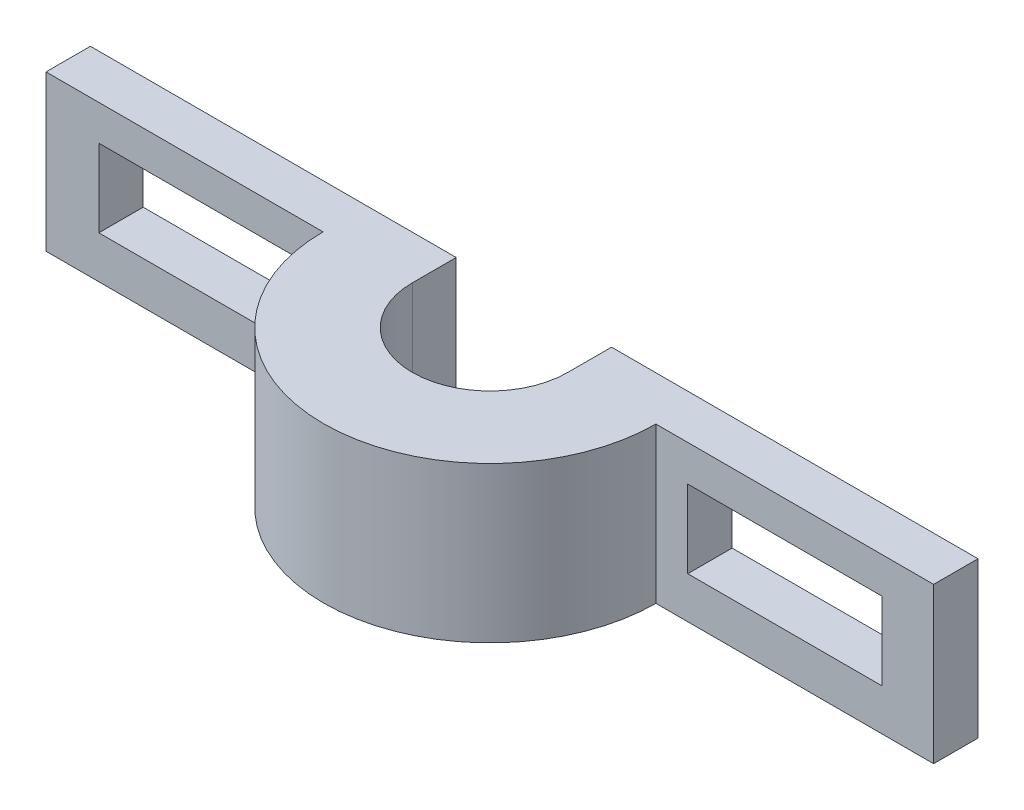
ISO-10303-21;
HEADER;
FILE_DESCRIPTION(('STEP AP214'),'2;1');
FILE_NAME('part.step','',(''),(''),'','','');
FILE_SCHEMA(('AUTOMOTIVE_DESIGN { 1 0 10303 214 1 1 1 1 }'));
ENDSEC;
DATA;
#1=APPLICATION_CONTEXT('core data for automotive mechanical design processes');
#2=APPLICATION_PROTOCOL_DEFINITION('international standard','automotive_design',2000,#1);
#3=PRODUCT_CONTEXT('',#1,'mechanical');
#4=PRODUCT('Part','Part','',(#3));
#5=PRODUCT_RELATED_PRODUCT_CATEGORY('part','',(#4));
#6=PRODUCT_DEFINITION_FORMATION('','',#4);
#7=PRODUCT_DEFINITION_CONTEXT('part definition',#1,'design');
#8=PRODUCT_DEFINITION('design','',#6,#7);
#9=PRODUCT_DEFINITION_SHAPE('','',#8);
#10=(LENGTH_UNIT() NAMED_UNIT(*) SI_UNIT(.MILLI.,.METRE.));
#11=(NAMED_UNIT(*) PLANE_ANGLE_UNIT() SI_UNIT($,.RADIAN.));
#12=(NAMED_UNIT(*) SI_UNIT($,.STERADIAN.) SOLID_ANGLE_UNIT());
#13=UNCERTAINTY_MEASURE_WITH_UNIT(LENGTH_MEASURE(1.E-05),#10,'distance_accuracy_value','');
#14=(GEOMETRIC_REPRESENTATION_CONTEXT(3) GLOBAL_UNCERTAINTY_ASSIGNED_CONTEXT((#13)) GLOBAL_UNIT_ASSIGNED_CONTEXT((#10,
#11,#12)) REPRESENTATION_CONTEXT('',''));
#15=CARTESIAN_POINT('',(0.,0.,0.));
#16=DIRECTION('',(0.,0.,1.));
#17=DIRECTION('',(1.,0.,0.));
#18=AXIS2_PLACEMENT_3D('',#15,#16,#17);
#19=CARTESIAN_POINT('',(0.,7.,0.));
#20=DIRECTION('',(0.,-1.,0.));
#21=DIRECTION('',(0.,0.,-1.));
#22=AXIS2_PLACEMENT_3D('',#19,#20,#21);
#23=CYLINDRICAL_SURFACE('',#22,3.5);
#24=CARTESIAN_POINT('',(0.,0.,0.));
#25=DIRECTION('',(0.,-1.,0.));
#26=DIRECTION('',(0.,0.,-1.));
#27=AXIS2_PLACEMENT_3D('',#24,#25,#26);
#28=CIRCLE('',#27,3.5);
#29=CARTESIAN_POINT('',(3.5,0.,0.));
#30=VERTEX_POINT('',#29);
#31=CARTESIAN_POINT('',(-3.5,0.,0.));
#32=VERTEX_POINT('',#31);
#33=EDGE_CURVE('E386',#30,#32,#28,.T.);
#34=ORIENTED_EDGE('',*,*,#33,.T.);
#35=DIRECTION('',(0.,-1.,0.));
#36=VECTOR('',#35,1.);
#37=CARTESIAN_POINT('',(-3.5,7.,0.));
#38=LINE('',#37,#36);
#39=CARTESIAN_POINT('',(-3.5,7.,0.));
#40=VERTEX_POINT('',#39);
#41=EDGE_CURVE('E390',#40,#32,#38,.T.);
#42=ORIENTED_EDGE('',*,*,#41,.F.);
#43=CARTESIAN_POINT('',(0.,7.,0.));
#44=DIRECTION('',(0.,-1.,0.));
#45=DIRECTION('',(0.,0.,-1.));
#46=AXIS2_PLACEMENT_3D('',#43,#44,#45);
#47=CIRCLE('',#46,3.5);
#48=CARTESIAN_POINT('',(3.5,7.,0.));
#49=VERTEX_POINT('',#48);
#50=EDGE_CURVE('E187',#49,#40,#47,.T.);
#51=ORIENTED_EDGE('',*,*,#50,.F.);
#52=DIRECTION('',(0.,-1.,0.));
#53=VECTOR('',#52,1.);
#54=CARTESIAN_POINT('',(3.5,7.,0.));
#55=LINE('',#54,#53);
#56=EDGE_CURVE('E391',#49,#30,#55,.T.);
#57=ORIENTED_EDGE('',*,*,#56,.T.);
#58=EDGE_LOOP('',(#34,#42,#51,#57));
#59=FACE_BOUND('',#58,.T.);
#60=ADVANCED_FACE('F45',(#59),#23,.F.);
#61=CARTESIAN_POINT('',(-19.9853337708473,7.,-1.9751587177036));
#62=DIRECTION('',(0.,0.,-1.));
#63=DIRECTION('',(-1.,0.,0.));
#64=AXIS2_PLACEMENT_3D('',#61,#62,#63);
#65=PLANE('',#64);
#66=DIRECTION('',(0.,-1.,0.));
#67=VECTOR('',#66,1.);
#68=CARTESIAN_POINT('',(3.5,7.,-1.9751587177036));
#69=LINE('',#68,#67);
#70=CARTESIAN_POINT('',(3.5,7.,-1.9751587177036));
#71=VERTEX_POINT('',#70);
#72=CARTESIAN_POINT('',(3.5,0.,-1.9751587177036));
#73=VERTEX_POINT('',#72);
#74=EDGE_CURVE('E176',#71,#73,#69,.T.);
#75=ORIENTED_EDGE('',*,*,#74,.F.);
#76=DIRECTION('',(1.,0.,0.));
#77=VECTOR('',#76,1.);
#78=CARTESIAN_POINT('',(-19.9853337708473,7.,-1.9751587177036));
#79=LINE('',#78,#77);
#80=CARTESIAN_POINT('',(20.0146662291527,7.,-1.9751587177036));
#81=VERTEX_POINT('',#80);
#82=EDGE_CURVE('E197',#71,#81,#79,.T.);
#83=ORIENTED_EDGE('',*,*,#82,.T.);
#84=DIRECTION('',(0.,-1.,0.));
#85=VECTOR('',#84,1.);
#86=CARTESIAN_POINT('',(20.0146662291527,7.,-1.9751587177036));
#87=LINE('',#86,#85);
#88=CARTESIAN_POINT('',(20.0146662291527,0.,-1.9751587177036));
#89=VERTEX_POINT('',#88);
#90=EDGE_CURVE('E216',#81,#89,#87,.T.);
#91=ORIENTED_EDGE('',*,*,#90,.T.);
#92=DIRECTION('',(1.,0.,0.));
#93=VECTOR('',#92,1.);
#94=CARTESIAN_POINT('',(-19.9853337708473,0.,-1.9751587177036));
#95=LINE('',#94,#93);
#96=EDGE_CURVE('E221',#73,#89,#95,.T.);
#97=ORIENTED_EDGE('',*,*,#96,.F.);
#98=EDGE_LOOP('',(#75,#83,#91,#97));
#99=FACE_BOUND('',#98,.T.);
#100=DIRECTION('',(0.,-1.,0.));
#101=VECTOR('',#100,1.);
#102=CARTESIAN_POINT('',(17.6901271123471,5.37574665961989,-1.9751587177036));
#103=LINE('',#102,#101);
#104=CARTESIAN_POINT('',(17.6901271123471,5.37574665961989,-1.9751587177036));
#105=VERTEX_POINT('',#104);
#106=CARTESIAN_POINT('',(17.6901271123471,1.87574665961989,-1.9751587177036));
#107=VERTEX_POINT('',#106);
#108=EDGE_CURVE('E299',#105,#107,#103,.T.);
#109=ORIENTED_EDGE('',*,*,#108,.F.);
#110=DIRECTION('',(1.,0.,0.));
#111=VECTOR('',#110,1.);
#112=CARTESIAN_POINT('',(-19.9853337708473,5.37574665961989,-1.9751587177036));
#113=LINE('',#112,#111);
#114=CARTESIAN_POINT('',(8.93428933754407,5.37574665961989,-1.9751587177036));
#115=VERTEX_POINT('',#114);
#116=EDGE_CURVE('E345',#115,#105,#113,.T.);
#117=ORIENTED_EDGE('',*,*,#116,.F.);
#118=DIRECTION('',(0.,1.,0.));
#119=VECTOR('',#118,1.);
#120=CARTESIAN_POINT('',(8.93428933754407,7.,-1.9751587177036));
#121=LINE('',#120,#119);
#122=CARTESIAN_POINT('',(8.93428933754407,1.87574665961989,-1.9751587177036));
#123=VERTEX_POINT('',#122);
#124=EDGE_CURVE('E206',#123,#115,#121,.T.);
#125=ORIENTED_EDGE('',*,*,#124,.F.);
#126=DIRECTION('',(-1.,0.,0.));
#127=VECTOR('',#126,1.);
#128=CARTESIAN_POINT('',(-19.9853337708473,1.87574665961989,-1.9751587177036));
#129=LINE('',#128,#127);
#130=EDGE_CURVE('E328',#107,#123,#129,.T.);
#131=ORIENTED_EDGE('',*,*,#130,.F.);
#132=EDGE_LOOP('',(#109,#117,#125,#131));
#133=FACE_BOUND('',#132,.T.);
#134=ADVANCED_FACE('F365',(#99,#133),#65,.T.);
#135=CARTESIAN_POINT('',(0.,7.,0.));
#136=DIRECTION('',(0.,-1.,0.));
#137=DIRECTION('',(0.,0.,-1.));
#138=AXIS2_PLACEMENT_3D('',#135,#136,#137);
#139=CYLINDRICAL_SURFACE('',#138,7.5);
#140=DIRECTION('',(0.,-1.,0.));
#141=VECTOR('',#140,1.);
#142=CARTESIAN_POINT('',(7.49995886060009,7.,0.0248412822963966));
#143=LINE('',#142,#141);
#144=CARTESIAN_POINT('',(7.49995886060009,7.,0.0248412822963966));
#145=VERTEX_POINT('',#144);
#146=CARTESIAN_POINT('',(7.49995886060009,0.,0.0248412822963966));
#147=VERTEX_POINT('',#146);
#148=EDGE_CURVE('E249',#145,#147,#143,.T.);
#149=ORIENTED_EDGE('',*,*,#148,.F.);
#150=CARTESIAN_POINT('',(0.,7.,0.));
#151=DIRECTION('',(0.,1.,0.));
#152=DIRECTION('',(0.,0.,1.));
#153=AXIS2_PLACEMENT_3D('',#150,#151,#152);
#154=CIRCLE('',#153,7.5);
#155=CARTESIAN_POINT('',(-7.49995886060009,7.,0.0248412822963966));
#156=VERTEX_POINT('',#155);
#157=EDGE_CURVE('E254',#156,#145,#154,.T.);
#158=ORIENTED_EDGE('',*,*,#157,.F.);
#159=DIRECTION('',(0.,-1.,0.));
#160=VECTOR('',#159,1.);
#161=CARTESIAN_POINT('',(-7.49995886060009,7.,0.0248412822963966));
#162=LINE('',#161,#160);
#163=CARTESIAN_POINT('',(-7.4999588606001,0.,0.0248412822963966));
#164=VERTEX_POINT('',#163);
#165=EDGE_CURVE('E235',#164,#156,#162,.F.);
#166=ORIENTED_EDGE('',*,*,#165,.F.);
#167=CARTESIAN_POINT('',(0.,0.,0.));
#168=DIRECTION('',(0.,1.,0.));
#169=DIRECTION('',(0.,0.,1.));
#170=AXIS2_PLACEMENT_3D('',#167,#168,#169);
#171=CIRCLE('',#170,7.5);
#172=EDGE_CURVE('E253',#164,#147,#171,.T.);
#173=ORIENTED_EDGE('',*,*,#172,.T.);
#174=EDGE_LOOP('',(#149,#158,#166,#173));
#175=FACE_BOUND('',#174,.T.);
#176=ADVANCED_FACE('F47',(#175),#139,.T.);
#177=CARTESIAN_POINT('',(0.,7.,0.));
#178=DIRECTION('',(0.,1.,0.));
#179=DIRECTION('',(0.,0.,1.));
#180=AXIS2_PLACEMENT_3D('',#177,#178,#179);
#181=PLANE('',#180);
#182=DIRECTION('',(0.,0.,-1.));
#183=VECTOR('',#182,1.);
#184=CARTESIAN_POINT('',(-3.5,7.,0.));
#185=LINE('',#184,#183);
#186=CARTESIAN_POINT('',(-3.5,7.,-1.9751587177036));
#187=VERTEX_POINT('',#186);
#188=EDGE_CURVE('E61',#40,#187,#185,.T.);
#189=ORIENTED_EDGE('',*,*,#188,.T.);
#190=CARTESIAN_POINT('',(-19.9853337708473,7.,-1.9751587177036));
#191=VERTEX_POINT('',#190);
#192=EDGE_CURVE('E183',#191,#187,#79,.T.);
#193=ORIENTED_EDGE('',*,*,#192,.F.);
#194=DIRECTION('',(0.,0.,-1.));
#195=VECTOR('',#194,1.);
#196=CARTESIAN_POINT('',(-19.9853337708473,7.,0.0248412822963966));
#197=LINE('',#196,#195);
#198=CARTESIAN_POINT('',(-19.9853337708473,7.,0.0248412822963966));
#199=VERTEX_POINT('',#198);
#200=EDGE_CURVE('E213',#199,#191,#197,.T.);
#201=ORIENTED_EDGE('',*,*,#200,.F.);
#202=DIRECTION('',(1.,0.,0.));
#203=VECTOR('',#202,1.);
#204=CARTESIAN_POINT('',(-19.9853337708473,7.,0.0248412822963966));
#205=LINE('',#204,#203);
#206=EDGE_CURVE('E209',#199,#156,#205,.T.);
#207=ORIENTED_EDGE('',*,*,#206,.T.);
#208=ORIENTED_EDGE('',*,*,#157,.T.);
#209=CARTESIAN_POINT('',(20.0146662291527,7.,0.0248412822963966));
#210=VERTEX_POINT('',#209);
#211=EDGE_CURVE('E202',#145,#210,#205,.T.);
#212=ORIENTED_EDGE('',*,*,#211,.T.);
#213=DIRECTION('',(0.,0.,-1.));
#214=VECTOR('',#213,1.);
#215=CARTESIAN_POINT('',(20.0146662291527,7.,0.0248412822963966));
#216=LINE('',#215,#214);
#217=EDGE_CURVE('E196',#210,#81,#216,.T.);
#218=ORIENTED_EDGE('',*,*,#217,.T.);
#219=ORIENTED_EDGE('',*,*,#82,.F.);
#220=DIRECTION('',(0.,0.,1.));
#221=VECTOR('',#220,1.);
#222=CARTESIAN_POINT('',(3.5,7.,0.));
#223=LINE('',#222,#221);
#224=EDGE_CURVE('E177',#71,#49,#223,.T.);
#225=ORIENTED_EDGE('',*,*,#224,.T.);
#226=ORIENTED_EDGE('',*,*,#50,.T.);
#227=EDGE_LOOP('',(#189,#193,#201,#207,#208,#212,#218,#219,#225,#226));
#228=FACE_BOUND('',#227,.T.);
#229=ADVANCED_FACE('F181',(#228),#181,.T.);
#230=CARTESIAN_POINT('',(0.,0.,0.));
#231=DIRECTION('',(0.,1.,0.));
#232=DIRECTION('',(0.,0.,1.));
#233=AXIS2_PLACEMENT_3D('',#230,#231,#232);
#234=PLANE('',#233);
#235=CARTESIAN_POINT('',(-19.9853337708473,0.,-1.9751587177036));
#236=VERTEX_POINT('',#235);
#237=CARTESIAN_POINT('',(-3.5,0.,-1.9751587177036));
#238=VERTEX_POINT('',#237);
#239=EDGE_CURVE('E217',#236,#238,#95,.T.);
#240=ORIENTED_EDGE('',*,*,#239,.T.);
#241=DIRECTION('',(0.,0.,-1.));
#242=VECTOR('',#241,1.);
#243=CARTESIAN_POINT('',(-3.5,0.,0.));
#244=LINE('',#243,#242);
#245=EDGE_CURVE('E171',#32,#238,#244,.T.);
#246=ORIENTED_EDGE('',*,*,#245,.F.);
#247=ORIENTED_EDGE('',*,*,#33,.F.);
#248=DIRECTION('',(0.,0.,1.));
#249=VECTOR('',#248,1.);
#250=CARTESIAN_POINT('',(3.5,0.,0.));
#251=LINE('',#250,#249);
#252=EDGE_CURVE('E69',#73,#30,#251,.T.);
#253=ORIENTED_EDGE('',*,*,#252,.F.);
#254=ORIENTED_EDGE('',*,*,#96,.T.);
#255=DIRECTION('',(0.,0.,-1.));
#256=VECTOR('',#255,1.);
#257=CARTESIAN_POINT('',(20.0146662291527,0.,0.0248412822963966));
#258=LINE('',#257,#256);
#259=CARTESIAN_POINT('',(20.0146662291527,0.,0.0248412822963966));
#260=VERTEX_POINT('',#259);
#261=EDGE_CURVE('E220',#260,#89,#258,.T.);
#262=ORIENTED_EDGE('',*,*,#261,.F.);
#263=DIRECTION('',(1.,0.,0.));
#264=VECTOR('',#263,1.);
#265=CARTESIAN_POINT('',(-19.9853337708473,0.,0.0248412822963966));
#266=LINE('',#265,#264);
#267=EDGE_CURVE('E225',#147,#260,#266,.T.);
#268=ORIENTED_EDGE('',*,*,#267,.F.);
#269=ORIENTED_EDGE('',*,*,#172,.F.);
#270=CARTESIAN_POINT('',(-19.9853337708473,0.,0.0248412822963966));
#271=VERTEX_POINT('',#270);
#272=EDGE_CURVE('E226',#271,#164,#266,.T.);
#273=ORIENTED_EDGE('',*,*,#272,.F.);
#274=DIRECTION('',(0.,0.,-1.));
#275=VECTOR('',#274,1.);
#276=CARTESIAN_POINT('',(-19.9853337708473,0.,0.0248412822963966));
#277=LINE('',#276,#275);
#278=EDGE_CURVE('E204',#271,#236,#277,.T.);
#279=ORIENTED_EDGE('',*,*,#278,.T.);
#280=EDGE_LOOP('',(#240,#246,#247,#253,#254,#262,#268,#269,#273,#279));
#281=FACE_BOUND('',#280,.T.);
#282=ADVANCED_FACE('F359',(#281),#234,.F.);
#283=CARTESIAN_POINT('',(-19.9853337708473,7.,0.0248412822963966));
#284=DIRECTION('',(-1.,0.,0.));
#285=DIRECTION('',(0.,0.,1.));
#286=AXIS2_PLACEMENT_3D('',#283,#284,#285);
#287=PLANE('',#286);
#288=ORIENTED_EDGE('',*,*,#278,.F.);
#289=DIRECTION('',(0.,-1.,0.));
#290=VECTOR('',#289,1.);
#291=CARTESIAN_POINT('',(-19.9853337708473,7.,0.0248412822963966));
#292=LINE('',#291,#290);
#293=EDGE_CURVE('E236',#199,#271,#292,.T.);
#294=ORIENTED_EDGE('',*,*,#293,.F.);
#295=ORIENTED_EDGE('',*,*,#200,.T.);
#296=DIRECTION('',(0.,-1.,0.));
#297=VECTOR('',#296,1.);
#298=CARTESIAN_POINT('',(-19.9853337708473,7.,-1.9751587177036));
#299=LINE('',#298,#297);
#300=EDGE_CURVE('E193',#191,#236,#299,.T.);
#301=ORIENTED_EDGE('',*,*,#300,.T.);
#302=EDGE_LOOP('',(#288,#294,#295,#301));
#303=FACE_BOUND('',#302,.T.);
#304=ADVANCED_FACE('F384',(#303),#287,.T.);
#305=CARTESIAN_POINT('',(-19.9853337708473,7.,0.0248412822963966));
#306=DIRECTION('',(0.,0.,-1.));
#307=DIRECTION('',(-1.,0.,0.));
#308=AXIS2_PLACEMENT_3D('',#305,#306,#307);
#309=PLANE('',#308);
#310=DIRECTION('',(1.,0.,0.));
#311=VECTOR('',#310,1.);
#312=CARTESIAN_POINT('',(-18.6050470096143,1.90967128129818,0.0248412822963966));
#313=LINE('',#312,#311);
#314=CARTESIAN_POINT('',(-17.6050470096143,1.90967128129818,0.0248412822963966));
#315=VERTEX_POINT('',#314);
#316=CARTESIAN_POINT('',(-8.84920923481122,1.90967128129818,0.0248412822963966));
#317=VERTEX_POINT('',#316);
#318=EDGE_CURVE('E317',#315,#317,#313,.T.);
#319=ORIENTED_EDGE('',*,*,#318,.F.);
#320=DIRECTION('',(0.,1.,0.));
#321=VECTOR('',#320,1.);
#322=CARTESIAN_POINT('',(-17.6050470096143,5.40967128129818,0.0248412822963966));
#323=LINE('',#322,#321);
#324=CARTESIAN_POINT('',(-17.6050470096143,5.40967128129818,0.0248412822963966));
#325=VERTEX_POINT('',#324);
#326=EDGE_CURVE('E288',#315,#325,#323,.T.);
#327=ORIENTED_EDGE('',*,*,#326,.T.);
#328=DIRECTION('',(-1.,0.,0.));
#329=VECTOR('',#328,1.);
#330=CARTESIAN_POINT('',(-18.6050470096143,5.40967128129818,0.0248412822963966));
#331=LINE('',#330,#329);
#332=CARTESIAN_POINT('',(-8.84920923481122,5.40967128129818,0.0248412822963966));
#333=VERTEX_POINT('',#332);
#334=EDGE_CURVE('E334',#333,#325,#331,.T.);
#335=ORIENTED_EDGE('',*,*,#334,.F.);
#336=DIRECTION('',(0.,1.,0.));
#337=VECTOR('',#336,1.);
#338=CARTESIAN_POINT('',(-8.84920923481122,5.40967128129818,0.0248412822963966));
#339=LINE('',#338,#337);
#340=EDGE_CURVE('E339',#317,#333,#339,.T.);
#341=ORIENTED_EDGE('',*,*,#340,.F.);
#342=EDGE_LOOP('',(#319,#327,#335,#341));
#343=FACE_BOUND('',#342,.T.);
#344=ORIENTED_EDGE('',*,*,#272,.T.);
#345=ORIENTED_EDGE('',*,*,#165,.T.);
#346=ORIENTED_EDGE('',*,*,#206,.F.);
#347=ORIENTED_EDGE('',*,*,#293,.T.);
#348=EDGE_LOOP('',(#344,#345,#346,#347));
#349=FACE_BOUND('',#348,.T.);
#350=ADVANCED_FACE('F382',(#343,#349),#309,.F.);
#351=DIRECTION('',(0.,-1.,0.));
#352=VECTOR('',#351,1.);
#353=CARTESIAN_POINT('',(-3.5,7.,-1.9751587177036));
#354=LINE('',#353,#352);
#355=EDGE_CURVE('E168',#187,#238,#354,.T.);
#356=ORIENTED_EDGE('',*,*,#355,.T.);
#357=ORIENTED_EDGE('',*,*,#239,.F.);
#358=ORIENTED_EDGE('',*,*,#300,.F.);
#359=ORIENTED_EDGE('',*,*,#192,.T.);
#360=EDGE_LOOP('',(#356,#357,#358,#359));
#361=FACE_BOUND('',#360,.T.);
#362=DIRECTION('',(1.,0.,0.));
#363=VECTOR('',#362,1.);
#364=CARTESIAN_POINT('',(-19.9853337708473,5.40967128129818,-1.9751587177036));
#365=LINE('',#364,#363);
#366=CARTESIAN_POINT('',(-17.6050470096143,5.40967128129818,-1.9751587177036));
#367=VERTEX_POINT('',#366);
#368=CARTESIAN_POINT('',(-8.84920923481122,5.40967128129818,-1.9751587177036));
#369=VERTEX_POINT('',#368);
#370=EDGE_CURVE('E11',#367,#369,#365,.T.);
#371=ORIENTED_EDGE('',*,*,#370,.F.);
#372=DIRECTION('',(0.,1.,0.));
#373=VECTOR('',#372,1.);
#374=CARTESIAN_POINT('',(-17.6050470096143,5.40967128129818,-1.9751587177036));
#375=LINE('',#374,#373);
#376=CARTESIAN_POINT('',(-17.6050470096143,1.90967128129818,-1.9751587177036));
#377=VERTEX_POINT('',#376);
#378=EDGE_CURVE('E277',#377,#367,#375,.T.);
#379=ORIENTED_EDGE('',*,*,#378,.F.);
#380=DIRECTION('',(-1.,0.,0.));
#381=VECTOR('',#380,1.);
#382=CARTESIAN_POINT('',(-19.9853337708473,1.90967128129818,-1.9751587177036));
#383=LINE('',#382,#381);
#384=CARTESIAN_POINT('',(-8.84920923481122,1.90967128129818,-1.9751587177036));
#385=VERTEX_POINT('',#384);
#386=EDGE_CURVE('E258',#385,#377,#383,.T.);
#387=ORIENTED_EDGE('',*,*,#386,.F.);
#388=DIRECTION('',(0.,-1.,0.));
#389=VECTOR('',#388,1.);
#390=CARTESIAN_POINT('',(-8.84920923481122,7.,-1.9751587177036));
#391=LINE('',#390,#389);
#392=EDGE_CURVE('E54',#369,#385,#391,.T.);
#393=ORIENTED_EDGE('',*,*,#392,.F.);
#394=EDGE_LOOP('',(#371,#379,#387,#393));
#395=FACE_BOUND('',#394,.T.);
#396=ADVANCED_FACE('F190',(#361,#395),#65,.T.);
#397=DIRECTION('',(-1.,0.,0.));
#398=VECTOR('',#397,1.);
#399=CARTESIAN_POINT('',(8.93428933754407,5.37574665961989,0.0248412822963966));
#400=LINE('',#399,#398);
#401=CARTESIAN_POINT('',(17.6901271123471,5.37574665961989,0.0248412822963966));
#402=VERTEX_POINT('',#401);
#403=CARTESIAN_POINT('',(8.93428933754407,5.37574665961989,0.0248412822963966));
#404=VERTEX_POINT('',#403);
#405=EDGE_CURVE('E320',#402,#404,#400,.T.);
#406=ORIENTED_EDGE('',*,*,#405,.F.);
#407=DIRECTION('',(0.,-1.,0.));
#408=VECTOR('',#407,1.);
#409=CARTESIAN_POINT('',(17.6901271123471,5.37574665961989,0.0248412822963966));
#410=LINE('',#409,#408);
#411=CARTESIAN_POINT('',(17.6901271123471,1.87574665961989,0.0248412822963966));
#412=VERTEX_POINT('',#411);
#413=EDGE_CURVE('E294',#402,#412,#410,.T.);
#414=ORIENTED_EDGE('',*,*,#413,.T.);
#415=DIRECTION('',(1.,0.,0.));
#416=VECTOR('',#415,1.);
#417=CARTESIAN_POINT('',(8.93428933754407,1.87574665961989,0.0248412822963966));
#418=LINE('',#417,#416);
#419=CARTESIAN_POINT('',(8.93428933754407,1.87574665961989,0.0248412822963966));
#420=VERTEX_POINT('',#419);
#421=EDGE_CURVE('E316',#420,#412,#418,.T.);
#422=ORIENTED_EDGE('',*,*,#421,.F.);
#423=DIRECTION('',(0.,-1.,0.));
#424=VECTOR('',#423,1.);
#425=CARTESIAN_POINT('',(8.93428933754407,5.37574665961989,0.0248412822963966));
#426=LINE('',#425,#424);
#427=EDGE_CURVE('E313',#404,#420,#426,.T.);
#428=ORIENTED_EDGE('',*,*,#427,.F.);
#429=EDGE_LOOP('',(#406,#414,#422,#428));
#430=FACE_BOUND('',#429,.T.);
#431=ORIENTED_EDGE('',*,*,#211,.F.);
#432=ORIENTED_EDGE('',*,*,#148,.T.);
#433=ORIENTED_EDGE('',*,*,#267,.T.);
#434=DIRECTION('',(0.,-1.,0.));
#435=VECTOR('',#434,1.);
#436=CARTESIAN_POINT('',(20.0146662291527,7.,0.0248412822963966));
#437=LINE('',#436,#435);
#438=EDGE_CURVE('E239',#210,#260,#437,.T.);
#439=ORIENTED_EDGE('',*,*,#438,.F.);
#440=EDGE_LOOP('',(#431,#432,#433,#439));
#441=FACE_BOUND('',#440,.T.);
#442=ADVANCED_FACE('F374',(#430,#441),#309,.F.);
#443=CARTESIAN_POINT('',(20.0146662291527,7.,0.0248412822963966));
#444=DIRECTION('',(-1.,0.,0.));
#445=DIRECTION('',(0.,0.,1.));
#446=AXIS2_PLACEMENT_3D('',#443,#444,#445);
#447=PLANE('',#446);
#448=ORIENTED_EDGE('',*,*,#261,.T.);
#449=ORIENTED_EDGE('',*,*,#90,.F.);
#450=ORIENTED_EDGE('',*,*,#217,.F.);
#451=ORIENTED_EDGE('',*,*,#438,.T.);
#452=EDGE_LOOP('',(#448,#449,#450,#451));
#453=FACE_BOUND('',#452,.T.);
#454=ADVANCED_FACE('F370',(#453),#447,.F.);
#455=CARTESIAN_POINT('',(8.93428933754407,5.37574665961989,-6.9751587177036));
#456=DIRECTION('',(-1.,0.,0.));
#457=DIRECTION('',(0.,0.,1.));
#458=AXIS2_PLACEMENT_3D('',#455,#456,#457);
#459=PLANE('',#458);
#460=ORIENTED_EDGE('',*,*,#124,.T.);
#461=DIRECTION('',(0.,0.,1.));
#462=VECTOR('',#461,1.);
#463=CARTESIAN_POINT('',(8.93428933754407,5.37574665961989,-6.9751587177036));
#464=LINE('',#463,#462);
#465=EDGE_CURVE('E324',#115,#404,#464,.T.);
#466=ORIENTED_EDGE('',*,*,#465,.T.);
#467=ORIENTED_EDGE('',*,*,#427,.T.);
#468=DIRECTION('',(0.,0.,1.));
#469=VECTOR('',#468,1.);
#470=CARTESIAN_POINT('',(8.93428933754407,1.87574665961989,-6.9751587177036));
#471=LINE('',#470,#469);
#472=EDGE_CURVE('E323',#123,#420,#471,.T.);
#473=ORIENTED_EDGE('',*,*,#472,.F.);
#474=EDGE_LOOP('',(#460,#466,#467,#473));
#475=FACE_BOUND('',#474,.T.);
#476=ADVANCED_FACE('F434',(#475),#459,.F.);
#477=CARTESIAN_POINT('',(8.93428933754407,5.37574665961989,-6.9751587177036));
#478=DIRECTION('',(0.,1.,0.));
#479=DIRECTION('',(0.,0.,1.));
#480=AXIS2_PLACEMENT_3D('',#477,#478,#479);
#481=PLANE('',#480);
#482=ORIENTED_EDGE('',*,*,#116,.T.);
#483=DIRECTION('',(0.,0.,1.));
#484=VECTOR('',#483,1.);
#485=CARTESIAN_POINT('',(17.6901271123471,5.37574665961989,-1.9751587177036));
#486=LINE('',#485,#484);
#487=EDGE_CURVE('E303',#105,#402,#486,.T.);
#488=ORIENTED_EDGE('',*,*,#487,.T.);
#489=ORIENTED_EDGE('',*,*,#405,.T.);
#490=ORIENTED_EDGE('',*,*,#465,.F.);
#491=EDGE_LOOP('',(#482,#488,#489,#490));
#492=FACE_BOUND('',#491,.T.);
#493=ADVANCED_FACE('F413',(#492),#481,.F.);
#494=CARTESIAN_POINT('',(8.93428933754407,1.87574665961989,-6.9751587177036));
#495=DIRECTION('',(0.,-1.,0.));
#496=DIRECTION('',(0.,0.,-1.));
#497=AXIS2_PLACEMENT_3D('',#494,#495,#496);
#498=PLANE('',#497);
#499=ORIENTED_EDGE('',*,*,#421,.T.);
#500=DIRECTION('',(0.,0.,1.));
#501=VECTOR('',#500,1.);
#502=CARTESIAN_POINT('',(17.6901271123471,1.87574665961989,-1.9751587177036));
#503=LINE('',#502,#501);
#504=EDGE_CURVE('E307',#107,#412,#503,.T.);
#505=ORIENTED_EDGE('',*,*,#504,.F.);
#506=ORIENTED_EDGE('',*,*,#130,.T.);
#507=ORIENTED_EDGE('',*,*,#472,.T.);
#508=EDGE_LOOP('',(#499,#505,#506,#507));
#509=FACE_BOUND('',#508,.T.);
#510=ADVANCED_FACE('F404',(#509),#498,.F.);
#511=CARTESIAN_POINT('',(-18.6050470096143,5.40967128129818,-6.9751587177036));
#512=DIRECTION('',(0.,1.,0.));
#513=DIRECTION('',(0.,0.,1.));
#514=AXIS2_PLACEMENT_3D('',#511,#512,#513);
#515=PLANE('',#514);
#516=ORIENTED_EDGE('',*,*,#334,.T.);
#517=DIRECTION('',(0.,0.,1.));
#518=VECTOR('',#517,1.);
#519=CARTESIAN_POINT('',(-17.6050470096143,5.40967128129818,-1.9751587177036));
#520=LINE('',#519,#518);
#521=EDGE_CURVE('E290',#367,#325,#520,.T.);
#522=ORIENTED_EDGE('',*,*,#521,.F.);
#523=ORIENTED_EDGE('',*,*,#370,.T.);
#524=DIRECTION('',(0.,0.,1.));
#525=VECTOR('',#524,1.);
#526=CARTESIAN_POINT('',(-8.84920923481122,5.40967128129818,-6.9751587177036));
#527=LINE('',#526,#525);
#528=EDGE_CURVE('E273',#369,#333,#527,.T.);
#529=ORIENTED_EDGE('',*,*,#528,.T.);
#530=EDGE_LOOP('',(#516,#522,#523,#529));
#531=FACE_BOUND('',#530,.T.);
#532=ADVANCED_FACE('F402',(#531),#515,.F.);
#533=CARTESIAN_POINT('',(-8.84920923481122,5.40967128129818,-6.9751587177036));
#534=DIRECTION('',(1.,0.,0.));
#535=DIRECTION('',(0.,0.,-1.));
#536=AXIS2_PLACEMENT_3D('',#533,#534,#535);
#537=PLANE('',#536);
#538=ORIENTED_EDGE('',*,*,#392,.T.);
#539=DIRECTION('',(0.,0.,1.));
#540=VECTOR('',#539,1.);
#541=CARTESIAN_POINT('',(-8.84920923481122,1.90967128129818,-6.9751587177036));
#542=LINE('',#541,#540);
#543=EDGE_CURVE('E271',#385,#317,#542,.T.);
#544=ORIENTED_EDGE('',*,*,#543,.T.);
#545=ORIENTED_EDGE('',*,*,#340,.T.);
#546=ORIENTED_EDGE('',*,*,#528,.F.);
#547=EDGE_LOOP('',(#538,#544,#545,#546));
#548=FACE_BOUND('',#547,.T.);
#549=ADVANCED_FACE('F269',(#548),#537,.F.);
#550=CARTESIAN_POINT('',(-18.6050470096143,1.90967128129818,-6.9751587177036));
#551=DIRECTION('',(0.,-1.,0.));
#552=DIRECTION('',(0.,0.,-1.));
#553=AXIS2_PLACEMENT_3D('',#550,#551,#552);
#554=PLANE('',#553);
#555=ORIENTED_EDGE('',*,*,#386,.T.);
#556=DIRECTION('',(0.,0.,1.));
#557=VECTOR('',#556,1.);
#558=CARTESIAN_POINT('',(-17.6050470096143,1.90967128129818,-1.9751587177036));
#559=LINE('',#558,#557);
#560=EDGE_CURVE('E282',#377,#315,#559,.T.);
#561=ORIENTED_EDGE('',*,*,#560,.T.);
#562=ORIENTED_EDGE('',*,*,#318,.T.);
#563=ORIENTED_EDGE('',*,*,#543,.F.);
#564=EDGE_LOOP('',(#555,#561,#562,#563));
#565=FACE_BOUND('',#564,.T.);
#566=ADVANCED_FACE('F281',(#565),#554,.F.);
#567=CARTESIAN_POINT('',(17.6901271123471,5.37574665961989,-1.9751587177036));
#568=DIRECTION('',(-1.,0.,0.));
#569=DIRECTION('',(0.,0.,1.));
#570=AXIS2_PLACEMENT_3D('',#567,#568,#569);
#571=PLANE('',#570);
#572=ORIENTED_EDGE('',*,*,#413,.F.);
#573=ORIENTED_EDGE('',*,*,#487,.F.);
#574=ORIENTED_EDGE('',*,*,#108,.T.);
#575=ORIENTED_EDGE('',*,*,#504,.T.);
#576=EDGE_LOOP('',(#572,#573,#574,#575));
#577=FACE_BOUND('',#576,.T.);
#578=ADVANCED_FACE('F429',(#577),#571,.T.);
#579=CARTESIAN_POINT('',(-17.6050470096143,5.40967128129818,-1.9751587177036));
#580=DIRECTION('',(1.,0.,0.));
#581=DIRECTION('',(0.,0.,-1.));
#582=AXIS2_PLACEMENT_3D('',#579,#580,#581);
#583=PLANE('',#582);
#584=ORIENTED_EDGE('',*,*,#326,.F.);
#585=ORIENTED_EDGE('',*,*,#560,.F.);
#586=ORIENTED_EDGE('',*,*,#378,.T.);
#587=ORIENTED_EDGE('',*,*,#521,.T.);
#588=EDGE_LOOP('',(#584,#585,#586,#587));
#589=FACE_BOUND('',#588,.T.);
#590=ADVANCED_FACE('F285',(#589),#583,.T.);
#591=CARTESIAN_POINT('',(3.5,7.,0.));
#592=DIRECTION('',(1.,0.,0.));
#593=DIRECTION('',(0.,0.,-1.));
#594=AXIS2_PLACEMENT_3D('',#591,#592,#593);
#595=PLANE('',#594);
#596=ORIENTED_EDGE('',*,*,#252,.T.);
#597=ORIENTED_EDGE('',*,*,#56,.F.);
#598=ORIENTED_EDGE('',*,*,#224,.F.);
#599=ORIENTED_EDGE('',*,*,#74,.T.);
#600=EDGE_LOOP('',(#596,#597,#598,#599));
#601=FACE_BOUND('',#600,.T.);
#602=ADVANCED_FACE('F428',(#601),#595,.F.);
#603=CARTESIAN_POINT('',(-3.5,7.,0.));
#604=DIRECTION('',(-1.,0.,0.));
#605=DIRECTION('',(0.,0.,1.));
#606=AXIS2_PLACEMENT_3D('',#603,#604,#605);
#607=PLANE('',#606);
#608=ORIENTED_EDGE('',*,*,#245,.T.);
#609=ORIENTED_EDGE('',*,*,#355,.F.);
#610=ORIENTED_EDGE('',*,*,#188,.F.);
#611=ORIENTED_EDGE('',*,*,#41,.T.);
#612=EDGE_LOOP('',(#608,#609,#610,#611));
#613=FACE_BOUND('',#612,.T.);
#614=ADVANCED_FACE('F169',(#613),#607,.F.);
#615=CLOSED_SHELL('',(#60,#134,#176,#229,#282,#304,#350,#396,#442,#454,#476,#493,#510,#532,#549,
#566,#578,#590,#602,#614));
#616=MANIFOLD_SOLID_BREP('B2',#615);
#617=ADVANCED_BREP_SHAPE_REPRESENTATION('',(#18,#616),#14);
#618=SHAPE_DEFINITION_REPRESENTATION(#9,#617);
ENDSEC;
END-ISO-10303-21;
